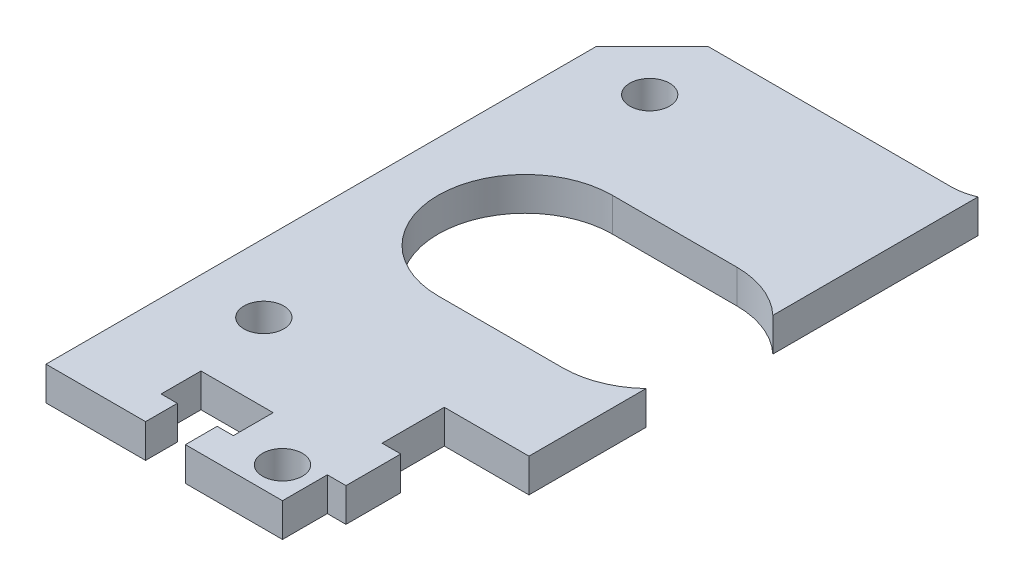
ISO-10303-21;
HEADER;
FILE_DESCRIPTION(('STEP AP214'),'2;1');
FILE_NAME('part.step','',(''),(''),'','','');
FILE_SCHEMA(('AUTOMOTIVE_DESIGN { 1 0 10303 214 1 1 1 1 }'));
ENDSEC;
DATA;
#1=APPLICATION_CONTEXT('core data for automotive mechanical design processes');
#2=APPLICATION_PROTOCOL_DEFINITION('international standard','automotive_design',2000,#1);
#3=PRODUCT_CONTEXT('',#1,'mechanical');
#4=PRODUCT('Part','Part','',(#3));
#5=PRODUCT_RELATED_PRODUCT_CATEGORY('part','',(#4));
#6=PRODUCT_DEFINITION_FORMATION('','',#4);
#7=PRODUCT_DEFINITION_CONTEXT('part definition',#1,'design');
#8=PRODUCT_DEFINITION('design','',#6,#7);
#9=PRODUCT_DEFINITION_SHAPE('','',#8);
#10=(LENGTH_UNIT() NAMED_UNIT(*) SI_UNIT(.MILLI.,.METRE.));
#11=(NAMED_UNIT(*) PLANE_ANGLE_UNIT() SI_UNIT($,.RADIAN.));
#12=(NAMED_UNIT(*) SI_UNIT($,.STERADIAN.) SOLID_ANGLE_UNIT());
#13=UNCERTAINTY_MEASURE_WITH_UNIT(LENGTH_MEASURE(1.E-05),#10,'distance_accuracy_value','');
#14=(GEOMETRIC_REPRESENTATION_CONTEXT(3) GLOBAL_UNCERTAINTY_ASSIGNED_CONTEXT((#13)) GLOBAL_UNIT_ASSIGNED_CONTEXT((#10,
#11,#12)) REPRESENTATION_CONTEXT('',''));
#15=CARTESIAN_POINT('',(0.,0.,0.));
#16=DIRECTION('',(0.,0.,1.));
#17=DIRECTION('',(1.,0.,0.));
#18=AXIS2_PLACEMENT_3D('',#15,#16,#17);
#19=CARTESIAN_POINT('',(0.,-1.35,0.));
#20=DIRECTION('',(0.,1.,0.));
#21=DIRECTION('',(1.,0.,0.));
#22=AXIS2_PLACEMENT_3D('',#19,#20,#21);
#23=PLANE('',#22);
#24=DIRECTION('',(1.,0.,0.));
#25=VECTOR('',#24,1.);
#26=CARTESIAN_POINT('',(-21.,-1.35,27.5));
#27=LINE('',#26,#25);
#28=CARTESIAN_POINT('',(-21.,-1.35,27.5));
#29=VERTEX_POINT('',#28);
#30=CARTESIAN_POINT('',(-13.,-1.35,27.5));
#31=VERTEX_POINT('',#30);
#32=EDGE_CURVE('E211',#29,#31,#27,.T.);
#33=ORIENTED_EDGE('',*,*,#32,.F.);
#34=DIRECTION('',(0.,0.,1.));
#35=VECTOR('',#34,1.);
#36=CARTESIAN_POINT('',(-21.,-1.35,-16.7));
#37=LINE('',#36,#35);
#38=CARTESIAN_POINT('',(-21.,-1.35,-16.7));
#39=VERTEX_POINT('',#38);
#40=EDGE_CURVE('E36',#39,#29,#37,.T.);
#41=ORIENTED_EDGE('',*,*,#40,.F.);
#42=DIRECTION('',(0.707106781186548,0.,-0.707106781186548));
#43=VECTOR('',#42,1.);
#44=CARTESIAN_POINT('',(-21.,-1.35,-16.7));
#45=LINE('',#44,#43);
#46=CARTESIAN_POINT('',(-16.5,-1.35,-21.2));
#47=VERTEX_POINT('',#46);
#48=EDGE_CURVE('E11',#39,#47,#45,.T.);
#49=ORIENTED_EDGE('',*,*,#48,.T.);
#50=DIRECTION('',(-1.,0.,0.));
#51=VECTOR('',#50,1.);
#52=CARTESIAN_POINT('',(3.,-1.35,-21.2));
#53=LINE('',#52,#51);
#54=CARTESIAN_POINT('',(3.,-1.35,-21.2));
#55=VERTEX_POINT('',#54);
#56=EDGE_CURVE('E237',#55,#47,#53,.T.);
#57=ORIENTED_EDGE('',*,*,#56,.F.);
#58=CARTESIAN_POINT('',(3.,-1.35,-25.7));
#59=DIRECTION('',(0.,1.,0.));
#60=DIRECTION('',(0.,0.,1.));
#61=AXIS2_PLACEMENT_3D('',#58,#59,#60);
#62=CIRCLE('',#61,4.5);
#63=CARTESIAN_POINT('',(4.8,-1.35,-21.57568187454));
#64=VERTEX_POINT('',#63);
#65=EDGE_CURVE('E27',#55,#64,#62,.T.);
#66=ORIENTED_EDGE('',*,*,#65,.T.);
#67=DIRECTION('',(0.,0.,-1.));
#68=VECTOR('',#67,1.);
#69=CARTESIAN_POINT('',(4.8,-1.35,-5.095095681143));
#70=LINE('',#69,#68);
#71=CARTESIAN_POINT('',(4.8,-1.35,-5.095095681143));
#72=VERTEX_POINT('',#71);
#73=EDGE_CURVE('E246',#72,#64,#70,.T.);
#74=ORIENTED_EDGE('',*,*,#73,.F.);
#75=CARTESIAN_POINT('',(0.,-1.35,0.));
#76=DIRECTION('',(0.,-1.,0.));
#77=DIRECTION('',(0.,0.,-1.));
#78=AXIS2_PLACEMENT_3D('',#75,#76,#77);
#79=CIRCLE('',#78,7.);
#80=CARTESIAN_POINT('',(0.,-1.35,-7.));
#81=VERTEX_POINT('',#80);
#82=EDGE_CURVE('E257',#81,#72,#79,.T.);
#83=ORIENTED_EDGE('',*,*,#82,.F.);
#84=DIRECTION('',(1.,0.,0.));
#85=VECTOR('',#84,1.);
#86=CARTESIAN_POINT('',(-10.,-1.35,-7.));
#87=LINE('',#86,#85);
#88=CARTESIAN_POINT('',(-10.,-1.35,-7.));
#89=VERTEX_POINT('',#88);
#90=EDGE_CURVE('E231',#89,#81,#87,.T.);
#91=ORIENTED_EDGE('',*,*,#90,.F.);
#92=CARTESIAN_POINT('',(-10.,-1.35,0.));
#93=DIRECTION('',(0.,-1.,0.));
#94=DIRECTION('',(0.,0.,1.));
#95=AXIS2_PLACEMENT_3D('',#92,#93,#94);
#96=CIRCLE('',#95,7.);
#97=CARTESIAN_POINT('',(-10.,-1.35,7.));
#98=VERTEX_POINT('',#97);
#99=EDGE_CURVE('E285',#98,#89,#96,.T.);
#100=ORIENTED_EDGE('',*,*,#99,.F.);
#101=DIRECTION('',(-1.,0.,0.));
#102=VECTOR('',#101,1.);
#103=CARTESIAN_POINT('',(0.,-1.35,7.));
#104=LINE('',#103,#102);
#105=CARTESIAN_POINT('',(0.,-1.35,7.));
#106=VERTEX_POINT('',#105);
#107=EDGE_CURVE('E288',#106,#98,#104,.T.);
#108=ORIENTED_EDGE('',*,*,#107,.F.);
#109=CARTESIAN_POINT('',(0.,-1.35,0.));
#110=DIRECTION('',(0.,-1.,0.));
#111=DIRECTION('',(0.685714285714307,0.,0.727870811591808));
#112=AXIS2_PLACEMENT_3D('',#109,#110,#111);
#113=CIRCLE('',#112,7.);
#114=CARTESIAN_POINT('',(4.8,-1.35,5.095095681143));
#115=VERTEX_POINT('',#114);
#116=EDGE_CURVE('E281',#115,#106,#113,.T.);
#117=ORIENTED_EDGE('',*,*,#116,.F.);
#118=DIRECTION('',(0.,0.,-1.));
#119=VECTOR('',#118,1.);
#120=CARTESIAN_POINT('',(4.8,-1.35,14.5));
#121=LINE('',#120,#119);
#122=CARTESIAN_POINT('',(4.8,-1.35,14.5));
#123=VERTEX_POINT('',#122);
#124=EDGE_CURVE('E245',#123,#115,#121,.T.);
#125=ORIENTED_EDGE('',*,*,#124,.F.);
#126=DIRECTION('',(-1.,0.,0.));
#127=VECTOR('',#126,1.);
#128=CARTESIAN_POINT('',(4.8,-1.35,14.5));
#129=LINE('',#128,#127);
#130=CARTESIAN_POINT('',(-2.,-1.35,14.5));
#131=VERTEX_POINT('',#130);
#132=EDGE_CURVE('E421',#123,#131,#129,.T.);
#133=ORIENTED_EDGE('',*,*,#132,.T.);
#134=DIRECTION('',(0.,0.,1.));
#135=VECTOR('',#134,1.);
#136=CARTESIAN_POINT('',(-2.,-1.35,14.5));
#137=LINE('',#136,#135);
#138=CARTESIAN_POINT('',(-2.,-1.35,19.5));
#139=VERTEX_POINT('',#138);
#140=EDGE_CURVE('E442',#131,#139,#137,.T.);
#141=ORIENTED_EDGE('',*,*,#140,.T.);
#142=DIRECTION('',(1.,0.,0.));
#143=VECTOR('',#142,1.);
#144=CARTESIAN_POINT('',(-2.,-1.35,19.5));
#145=LINE('',#144,#143);
#146=CARTESIAN_POINT('',(-0.5,-1.35,19.5));
#147=VERTEX_POINT('',#146);
#148=EDGE_CURVE('E445',#139,#147,#145,.T.);
#149=ORIENTED_EDGE('',*,*,#148,.T.);
#150=DIRECTION('',(0.,0.,1.));
#151=VECTOR('',#150,1.);
#152=CARTESIAN_POINT('',(-0.5,-1.35,19.5));
#153=LINE('',#152,#151);
#154=CARTESIAN_POINT('',(-0.5,-1.35,23.9));
#155=VERTEX_POINT('',#154);
#156=EDGE_CURVE('E448',#147,#155,#153,.T.);
#157=ORIENTED_EDGE('',*,*,#156,.T.);
#158=DIRECTION('',(-1.,0.,0.));
#159=VECTOR('',#158,1.);
#160=CARTESIAN_POINT('',(-0.5,-1.35,23.9));
#161=LINE('',#160,#159);
#162=CARTESIAN_POINT('',(-2.,-1.35,23.9));
#163=VERTEX_POINT('',#162);
#164=EDGE_CURVE('E451',#155,#163,#161,.T.);
#165=ORIENTED_EDGE('',*,*,#164,.T.);
#166=DIRECTION('',(0.,0.,-1.));
#167=VECTOR('',#166,1.);
#168=CARTESIAN_POINT('',(-2.,-1.35,27.5));
#169=LINE('',#168,#167);
#170=CARTESIAN_POINT('',(-2.,-1.35,27.5));
#171=VERTEX_POINT('',#170);
#172=EDGE_CURVE('E277',#171,#163,#169,.T.);
#173=ORIENTED_EDGE('',*,*,#172,.F.);
#174=DIRECTION('',(1.,0.,0.));
#175=VECTOR('',#174,1.);
#176=CARTESIAN_POINT('',(-9.8,-1.35,27.5));
#177=LINE('',#176,#175);
#178=CARTESIAN_POINT('',(-9.8,-1.35,27.5));
#179=VERTEX_POINT('',#178);
#180=EDGE_CURVE('E213',#179,#171,#177,.T.);
#181=ORIENTED_EDGE('',*,*,#180,.F.);
#182=DIRECTION('',(0.,0.,-1.));
#183=VECTOR('',#182,1.);
#184=CARTESIAN_POINT('',(-9.8,-1.35,27.5));
#185=LINE('',#184,#183);
#186=CARTESIAN_POINT('',(-9.8,-1.35,24.95));
#187=VERTEX_POINT('',#186);
#188=EDGE_CURVE('E454',#179,#187,#185,.T.);
#189=ORIENTED_EDGE('',*,*,#188,.T.);
#190=DIRECTION('',(1.,0.,0.));
#191=VECTOR('',#190,1.);
#192=CARTESIAN_POINT('',(-9.8,-1.35,24.95));
#193=LINE('',#192,#191);
#194=CARTESIAN_POINT('',(-8.5,-1.35,24.95));
#195=VERTEX_POINT('',#194);
#196=EDGE_CURVE('E458',#187,#195,#193,.T.);
#197=ORIENTED_EDGE('',*,*,#196,.T.);
#198=DIRECTION('',(0.,0.,-1.));
#199=VECTOR('',#198,1.);
#200=CARTESIAN_POINT('',(-8.5,-1.35,24.95));
#201=LINE('',#200,#199);
#202=CARTESIAN_POINT('',(-8.5,-1.35,21.75));
#203=VERTEX_POINT('',#202);
#204=EDGE_CURVE('E403',#195,#203,#201,.T.);
#205=ORIENTED_EDGE('',*,*,#204,.T.);
#206=DIRECTION('',(-1.,0.,0.));
#207=VECTOR('',#206,1.);
#208=CARTESIAN_POINT('',(-8.5,-1.35,21.75));
#209=LINE('',#208,#207);
#210=CARTESIAN_POINT('',(-14.3,-1.35,21.75));
#211=VERTEX_POINT('',#210);
#212=EDGE_CURVE('E401',#203,#211,#209,.T.);
#213=ORIENTED_EDGE('',*,*,#212,.T.);
#214=DIRECTION('',(0.,0.,1.));
#215=VECTOR('',#214,1.);
#216=CARTESIAN_POINT('',(-14.3,-1.35,21.75));
#217=LINE('',#216,#215);
#218=CARTESIAN_POINT('',(-14.3,-1.35,24.95));
#219=VERTEX_POINT('',#218);
#220=EDGE_CURVE('E396',#211,#219,#217,.T.);
#221=ORIENTED_EDGE('',*,*,#220,.T.);
#222=DIRECTION('',(1.,0.,0.));
#223=VECTOR('',#222,1.);
#224=CARTESIAN_POINT('',(-14.3,-1.35,24.95));
#225=LINE('',#224,#223);
#226=CARTESIAN_POINT('',(-13.,-1.35,24.95));
#227=VERTEX_POINT('',#226);
#228=EDGE_CURVE('E393',#219,#227,#225,.T.);
#229=ORIENTED_EDGE('',*,*,#228,.T.);
#230=DIRECTION('',(0.,0.,-1.));
#231=VECTOR('',#230,1.);
#232=CARTESIAN_POINT('',(-13.,-1.35,27.5));
#233=LINE('',#232,#231);
#234=EDGE_CURVE('E215',#31,#227,#233,.T.);
#235=ORIENTED_EDGE('',*,*,#234,.F.);
#236=EDGE_LOOP('',(#33,#41,#49,#57,#66,#74,#83,#91,#100,#108,#117,#125,#133,#141,#149,#157,#165,
#173,#181,#189,#197,#205,#213,#221,#229,#235));
#237=FACE_BOUND('',#236,.T.);
#238=CARTESIAN_POINT('',(-15.5,-1.35,15.5));
#239=DIRECTION('',(0.,-1.,0.));
#240=DIRECTION('',(-1.,0.,0.));
#241=AXIS2_PLACEMENT_3D('',#238,#239,#240);
#242=CIRCLE('',#241,1.6);
#243=CARTESIAN_POINT('',(-17.1,-1.35,15.5));
#244=VERTEX_POINT('',#243);
#245=EDGE_CURVE('E324',#244,#244,#242,.T.);
#246=ORIENTED_EDGE('',*,*,#245,.F.);
#247=EDGE_LOOP('',(#246));
#248=FACE_BOUND('',#247,.T.);
#249=CARTESIAN_POINT('',(-15.5,-1.35,-15.5));
#250=DIRECTION('',(0.,-1.,0.));
#251=DIRECTION('',(-1.,0.,0.));
#252=AXIS2_PLACEMENT_3D('',#249,#250,#251);
#253=CIRCLE('',#252,1.6);
#254=CARTESIAN_POINT('',(-17.1,-1.35,-15.5));
#255=VERTEX_POINT('',#254);
#256=EDGE_CURVE('E371',#255,#255,#253,.T.);
#257=ORIENTED_EDGE('',*,*,#256,.F.);
#258=EDGE_LOOP('',(#257));
#259=FACE_BOUND('',#258,.T.);
#260=CARTESIAN_POINT('',(-4.5,-1.35,25.));
#261=DIRECTION('',(0.,-1.,0.));
#262=DIRECTION('',(-1.,0.,0.));
#263=AXIS2_PLACEMENT_3D('',#260,#261,#262);
#264=CIRCLE('',#263,1.6);
#265=CARTESIAN_POINT('',(-6.1,-1.35,25.));
#266=VERTEX_POINT('',#265);
#267=EDGE_CURVE('E375',#266,#266,#264,.T.);
#268=ORIENTED_EDGE('',*,*,#267,.F.);
#269=EDGE_LOOP('',(#268));
#270=FACE_BOUND('',#269,.T.);
#271=ADVANCED_FACE('F17',(#237,#248,#259,#270),#23,.F.);
#272=CARTESIAN_POINT('',(-15.5,1.35,15.5));
#273=DIRECTION('',(0.,-1.,0.));
#274=DIRECTION('',(1.,0.,0.));
#275=AXIS2_PLACEMENT_3D('',#272,#273,#274);
#276=CYLINDRICAL_SURFACE('',#275,1.6);
#277=ORIENTED_EDGE('',*,*,#245,.T.);
#278=EDGE_LOOP('',(#277));
#279=FACE_BOUND('',#278,.T.);
#280=CARTESIAN_POINT('',(-15.5,1.35,15.5));
#281=DIRECTION('',(0.,-1.,0.));
#282=DIRECTION('',(1.,0.,0.));
#283=AXIS2_PLACEMENT_3D('',#280,#281,#282);
#284=CIRCLE('',#283,1.6);
#285=CARTESIAN_POINT('',(-13.9,1.35,15.5));
#286=VERTEX_POINT('',#285);
#287=EDGE_CURVE('E203',#286,#286,#284,.T.);
#288=ORIENTED_EDGE('',*,*,#287,.F.);
#289=EDGE_LOOP('',(#288));
#290=FACE_BOUND('',#289,.T.);
#291=ADVANCED_FACE('F520',(#279,#290),#276,.F.);
#292=CARTESIAN_POINT('',(0.,1.35,0.));
#293=DIRECTION('',(0.,1.,0.));
#294=DIRECTION('',(1.,0.,0.));
#295=AXIS2_PLACEMENT_3D('',#292,#293,#294);
#296=PLANE('',#295);
#297=DIRECTION('',(1.,0.,0.));
#298=VECTOR('',#297,1.);
#299=CARTESIAN_POINT('',(-14.3,1.35,24.95));
#300=LINE('',#299,#298);
#301=CARTESIAN_POINT('',(-14.3,1.35,24.95));
#302=VERTEX_POINT('',#301);
#303=CARTESIAN_POINT('',(-13.,1.35,24.95));
#304=VERTEX_POINT('',#303);
#305=EDGE_CURVE('E318',#302,#304,#300,.T.);
#306=ORIENTED_EDGE('',*,*,#305,.F.);
#307=DIRECTION('',(0.,0.,1.));
#308=VECTOR('',#307,1.);
#309=CARTESIAN_POINT('',(-14.3,1.35,21.75));
#310=LINE('',#309,#308);
#311=CARTESIAN_POINT('',(-14.3,1.35,21.75));
#312=VERTEX_POINT('',#311);
#313=EDGE_CURVE('E296',#312,#302,#310,.T.);
#314=ORIENTED_EDGE('',*,*,#313,.F.);
#315=DIRECTION('',(-1.,0.,0.));
#316=VECTOR('',#315,1.);
#317=CARTESIAN_POINT('',(-8.5,1.35,21.75));
#318=LINE('',#317,#316);
#319=CARTESIAN_POINT('',(-8.5,1.35,21.75));
#320=VERTEX_POINT('',#319);
#321=EDGE_CURVE('E300',#320,#312,#318,.T.);
#322=ORIENTED_EDGE('',*,*,#321,.F.);
#323=DIRECTION('',(0.,0.,-1.));
#324=VECTOR('',#323,1.);
#325=CARTESIAN_POINT('',(-8.5,1.35,24.95));
#326=LINE('',#325,#324);
#327=CARTESIAN_POINT('',(-8.5,1.35,24.95));
#328=VERTEX_POINT('',#327);
#329=EDGE_CURVE('E305',#328,#320,#326,.T.);
#330=ORIENTED_EDGE('',*,*,#329,.F.);
#331=DIRECTION('',(1.,0.,0.));
#332=VECTOR('',#331,1.);
#333=CARTESIAN_POINT('',(-9.8,1.35,24.95));
#334=LINE('',#333,#332);
#335=CARTESIAN_POINT('',(-9.8,1.35,24.95));
#336=VERTEX_POINT('',#335);
#337=EDGE_CURVE('E302',#336,#328,#334,.T.);
#338=ORIENTED_EDGE('',*,*,#337,.F.);
#339=DIRECTION('',(0.,0.,-1.));
#340=VECTOR('',#339,1.);
#341=CARTESIAN_POINT('',(-9.8,1.35,27.5));
#342=LINE('',#341,#340);
#343=CARTESIAN_POINT('',(-9.8,1.35,27.5));
#344=VERTEX_POINT('',#343);
#345=EDGE_CURVE('E232',#344,#336,#342,.T.);
#346=ORIENTED_EDGE('',*,*,#345,.F.);
#347=DIRECTION('',(1.,0.,0.));
#348=VECTOR('',#347,1.);
#349=CARTESIAN_POINT('',(-9.8,1.35,27.5));
#350=LINE('',#349,#348);
#351=CARTESIAN_POINT('',(-2.,1.35,27.5));
#352=VERTEX_POINT('',#351);
#353=EDGE_CURVE('E321',#344,#352,#350,.T.);
#354=ORIENTED_EDGE('',*,*,#353,.T.);
#355=DIRECTION('',(0.,0.,-1.));
#356=VECTOR('',#355,1.);
#357=CARTESIAN_POINT('',(-2.,1.35,27.5));
#358=LINE('',#357,#356);
#359=CARTESIAN_POINT('',(-2.,1.35,23.9));
#360=VERTEX_POINT('',#359);
#361=EDGE_CURVE('E325',#352,#360,#358,.T.);
#362=ORIENTED_EDGE('',*,*,#361,.T.);
#363=DIRECTION('',(-1.,0.,0.));
#364=VECTOR('',#363,1.);
#365=CARTESIAN_POINT('',(-0.5,1.35,23.9));
#366=LINE('',#365,#364);
#367=CARTESIAN_POINT('',(-0.5,1.35,23.9));
#368=VERTEX_POINT('',#367);
#369=EDGE_CURVE('E273',#368,#360,#366,.T.);
#370=ORIENTED_EDGE('',*,*,#369,.F.);
#371=DIRECTION('',(0.,0.,1.));
#372=VECTOR('',#371,1.);
#373=CARTESIAN_POINT('',(-0.5,1.35,19.5));
#374=LINE('',#373,#372);
#375=CARTESIAN_POINT('',(-0.5,1.35,19.5));
#376=VERTEX_POINT('',#375);
#377=EDGE_CURVE('E269',#376,#368,#374,.T.);
#378=ORIENTED_EDGE('',*,*,#377,.F.);
#379=DIRECTION('',(1.,0.,0.));
#380=VECTOR('',#379,1.);
#381=CARTESIAN_POINT('',(-2.,1.35,19.5));
#382=LINE('',#381,#380);
#383=CARTESIAN_POINT('',(-2.,1.35,19.5));
#384=VERTEX_POINT('',#383);
#385=EDGE_CURVE('E265',#384,#376,#382,.T.);
#386=ORIENTED_EDGE('',*,*,#385,.F.);
#387=DIRECTION('',(0.,0.,1.));
#388=VECTOR('',#387,1.);
#389=CARTESIAN_POINT('',(-2.,1.35,14.5));
#390=LINE('',#389,#388);
#391=CARTESIAN_POINT('',(-2.,1.35,14.5));
#392=VERTEX_POINT('',#391);
#393=EDGE_CURVE('E253',#392,#384,#390,.T.);
#394=ORIENTED_EDGE('',*,*,#393,.F.);
#395=DIRECTION('',(-1.,0.,0.));
#396=VECTOR('',#395,1.);
#397=CARTESIAN_POINT('',(4.8,1.35,14.5));
#398=LINE('',#397,#396);
#399=CARTESIAN_POINT('',(4.8,1.35,14.5));
#400=VERTEX_POINT('',#399);
#401=EDGE_CURVE('E261',#400,#392,#398,.T.);
#402=ORIENTED_EDGE('',*,*,#401,.F.);
#403=DIRECTION('',(0.,0.,-1.));
#404=VECTOR('',#403,1.);
#405=CARTESIAN_POINT('',(4.8,1.35,14.5));
#406=LINE('',#405,#404);
#407=CARTESIAN_POINT('',(4.8,1.35,5.095095681143));
#408=VERTEX_POINT('',#407);
#409=EDGE_CURVE('E328',#400,#408,#406,.T.);
#410=ORIENTED_EDGE('',*,*,#409,.T.);
#411=CARTESIAN_POINT('',(0.,1.35,0.));
#412=DIRECTION('',(0.,-1.,0.));
#413=DIRECTION('',(0.685714285714307,0.,0.727870811591808));
#414=AXIS2_PLACEMENT_3D('',#411,#412,#413);
#415=CIRCLE('',#414,7.);
#416=CARTESIAN_POINT('',(0.,1.35,7.));
#417=VERTEX_POINT('',#416);
#418=EDGE_CURVE('E340',#408,#417,#415,.T.);
#419=ORIENTED_EDGE('',*,*,#418,.T.);
#420=DIRECTION('',(-1.,0.,0.));
#421=VECTOR('',#420,1.);
#422=CARTESIAN_POINT('',(0.,1.35,7.));
#423=LINE('',#422,#421);
#424=CARTESIAN_POINT('',(-10.,1.35,7.));
#425=VERTEX_POINT('',#424);
#426=EDGE_CURVE('E343',#417,#425,#423,.T.);
#427=ORIENTED_EDGE('',*,*,#426,.T.);
#428=CARTESIAN_POINT('',(-10.,1.35,0.));
#429=DIRECTION('',(0.,-1.,0.));
#430=DIRECTION('',(0.,0.,1.));
#431=AXIS2_PLACEMENT_3D('',#428,#429,#430);
#432=CIRCLE('',#431,7.);
#433=CARTESIAN_POINT('',(-10.,1.35,-7.));
#434=VERTEX_POINT('',#433);
#435=EDGE_CURVE('E346',#425,#434,#432,.T.);
#436=ORIENTED_EDGE('',*,*,#435,.T.);
#437=DIRECTION('',(1.,0.,0.));
#438=VECTOR('',#437,1.);
#439=CARTESIAN_POINT('',(-10.,1.35,-7.));
#440=LINE('',#439,#438);
#441=CARTESIAN_POINT('',(0.,1.35,-7.));
#442=VERTEX_POINT('',#441);
#443=EDGE_CURVE('E349',#434,#442,#440,.T.);
#444=ORIENTED_EDGE('',*,*,#443,.T.);
#445=CARTESIAN_POINT('',(0.,1.35,0.));
#446=DIRECTION('',(0.,-1.,0.));
#447=DIRECTION('',(0.,0.,-1.));
#448=AXIS2_PLACEMENT_3D('',#445,#446,#447);
#449=CIRCLE('',#448,7.);
#450=CARTESIAN_POINT('',(4.8,1.35,-5.095095681143));
#451=VERTEX_POINT('',#450);
#452=EDGE_CURVE('E352',#442,#451,#449,.T.);
#453=ORIENTED_EDGE('',*,*,#452,.T.);
#454=DIRECTION('',(0.,0.,-1.));
#455=VECTOR('',#454,1.);
#456=CARTESIAN_POINT('',(4.8,1.35,-5.095095681143));
#457=LINE('',#456,#455);
#458=CARTESIAN_POINT('',(4.8,1.35,-21.57568187454));
#459=VERTEX_POINT('',#458);
#460=EDGE_CURVE('E355',#451,#459,#457,.T.);
#461=ORIENTED_EDGE('',*,*,#460,.T.);
#462=CARTESIAN_POINT('',(3.,1.35,-25.7));
#463=DIRECTION('',(0.,-1.,0.));
#464=DIRECTION('',(0.399999999999988,0.,0.916515138991173));
#465=AXIS2_PLACEMENT_3D('',#462,#463,#464);
#466=CIRCLE('',#465,4.5);
#467=CARTESIAN_POINT('',(3.,1.35,-21.2));
#468=VERTEX_POINT('',#467);
#469=EDGE_CURVE('E358',#459,#468,#466,.T.);
#470=ORIENTED_EDGE('',*,*,#469,.T.);
#471=DIRECTION('',(-1.,0.,0.));
#472=VECTOR('',#471,1.);
#473=CARTESIAN_POINT('',(3.,1.35,-21.2));
#474=LINE('',#473,#472);
#475=CARTESIAN_POINT('',(-16.5,1.35,-21.2));
#476=VERTEX_POINT('',#475);
#477=EDGE_CURVE('E361',#468,#476,#474,.T.);
#478=ORIENTED_EDGE('',*,*,#477,.T.);
#479=DIRECTION('',(-0.707106781186548,0.,0.707106781186548));
#480=VECTOR('',#479,1.);
#481=CARTESIAN_POINT('',(-16.5,1.35,-21.2));
#482=LINE('',#481,#480);
#483=CARTESIAN_POINT('',(-21.,1.35,-16.7));
#484=VERTEX_POINT('',#483);
#485=EDGE_CURVE('E364',#476,#484,#482,.T.);
#486=ORIENTED_EDGE('',*,*,#485,.T.);
#487=DIRECTION('',(0.,0.,1.));
#488=VECTOR('',#487,1.);
#489=CARTESIAN_POINT('',(-21.,1.35,-16.7));
#490=LINE('',#489,#488);
#491=CARTESIAN_POINT('',(-21.,1.35,27.5));
#492=VERTEX_POINT('',#491);
#493=EDGE_CURVE('E208',#484,#492,#490,.T.);
#494=ORIENTED_EDGE('',*,*,#493,.T.);
#495=DIRECTION('',(1.,0.,0.));
#496=VECTOR('',#495,1.);
#497=CARTESIAN_POINT('',(-21.,1.35,27.5));
#498=LINE('',#497,#496);
#499=CARTESIAN_POINT('',(-13.,1.35,27.5));
#500=VERTEX_POINT('',#499);
#501=EDGE_CURVE('E189',#492,#500,#498,.T.);
#502=ORIENTED_EDGE('',*,*,#501,.T.);
#503=DIRECTION('',(0.,0.,-1.));
#504=VECTOR('',#503,1.);
#505=CARTESIAN_POINT('',(-13.,1.35,27.5));
#506=LINE('',#505,#504);
#507=EDGE_CURVE('E196',#500,#304,#506,.T.);
#508=ORIENTED_EDGE('',*,*,#507,.T.);
#509=EDGE_LOOP('',(#306,#314,#322,#330,#338,#346,#354,#362,#370,#378,#386,#394,#402,#410,#419,
#427,#436,#444,#453,#461,#470,#478,#486,#494,#502,#508));
#510=FACE_BOUND('',#509,.T.);
#511=ORIENTED_EDGE('',*,*,#287,.T.);
#512=EDGE_LOOP('',(#511));
#513=FACE_BOUND('',#512,.T.);
#514=CARTESIAN_POINT('',(-15.5,1.35,-15.5));
#515=DIRECTION('',(0.,-1.,0.));
#516=DIRECTION('',(-1.,0.,0.));
#517=AXIS2_PLACEMENT_3D('',#514,#515,#516);
#518=CIRCLE('',#517,1.6);
#519=CARTESIAN_POINT('',(-17.1,1.35,-15.5));
#520=VERTEX_POINT('',#519);
#521=EDGE_CURVE('E367',#520,#520,#518,.T.);
#522=ORIENTED_EDGE('',*,*,#521,.T.);
#523=EDGE_LOOP('',(#522));
#524=FACE_BOUND('',#523,.T.);
#525=CARTESIAN_POINT('',(-4.5,1.35,25.));
#526=DIRECTION('',(0.,-1.,0.));
#527=DIRECTION('',(-1.,0.,0.));
#528=AXIS2_PLACEMENT_3D('',#525,#526,#527);
#529=CIRCLE('',#528,1.6);
#530=CARTESIAN_POINT('',(-6.1,1.35,25.));
#531=VERTEX_POINT('',#530);
#532=EDGE_CURVE('E369',#531,#531,#529,.T.);
#533=ORIENTED_EDGE('',*,*,#532,.T.);
#534=EDGE_LOOP('',(#533));
#535=FACE_BOUND('',#534,.T.);
#536=ADVANCED_FACE('F205',(#510,#513,#524,#535),#296,.T.);
#537=CARTESIAN_POINT('',(-15.5,1.35,-15.5));
#538=DIRECTION('',(0.,-1.,0.));
#539=DIRECTION('',(1.,0.,0.));
#540=AXIS2_PLACEMENT_3D('',#537,#538,#539);
#541=CYLINDRICAL_SURFACE('',#540,1.6);
#542=ORIENTED_EDGE('',*,*,#256,.T.);
#543=EDGE_LOOP('',(#542));
#544=FACE_BOUND('',#543,.T.);
#545=ORIENTED_EDGE('',*,*,#521,.F.);
#546=EDGE_LOOP('',(#545));
#547=FACE_BOUND('',#546,.T.);
#548=ADVANCED_FACE('F530',(#544,#547),#541,.F.);
#549=CARTESIAN_POINT('',(-4.5,1.35,25.));
#550=DIRECTION('',(0.,-1.,0.));
#551=DIRECTION('',(1.,0.,0.));
#552=AXIS2_PLACEMENT_3D('',#549,#550,#551);
#553=CYLINDRICAL_SURFACE('',#552,1.6);
#554=ORIENTED_EDGE('',*,*,#267,.T.);
#555=EDGE_LOOP('',(#554));
#556=FACE_BOUND('',#555,.T.);
#557=ORIENTED_EDGE('',*,*,#532,.F.);
#558=EDGE_LOOP('',(#557));
#559=FACE_BOUND('',#558,.T.);
#560=ADVANCED_FACE('F533',(#556,#559),#553,.F.);
#561=CARTESIAN_POINT('',(-13.,1.35,24.95));
#562=DIRECTION('',(-1.,0.,0.));
#563=DIRECTION('',(0.,0.,1.));
#564=AXIS2_PLACEMENT_3D('',#561,#562,#563);
#565=PLANE('',#564);
#566=DIRECTION('',(0.,1.,0.));
#567=VECTOR('',#566,1.);
#568=CARTESIAN_POINT('',(-13.,-1.35,24.95));
#569=LINE('',#568,#567);
#570=EDGE_CURVE('E200',#227,#304,#569,.T.);
#571=ORIENTED_EDGE('',*,*,#570,.T.);
#572=ORIENTED_EDGE('',*,*,#507,.F.);
#573=DIRECTION('',(0.,1.,0.));
#574=VECTOR('',#573,1.);
#575=CARTESIAN_POINT('',(-13.,-1.35,27.5));
#576=LINE('',#575,#574);
#577=EDGE_CURVE('E198',#31,#500,#576,.T.);
#578=ORIENTED_EDGE('',*,*,#577,.F.);
#579=ORIENTED_EDGE('',*,*,#234,.T.);
#580=EDGE_LOOP('',(#571,#572,#578,#579));
#581=FACE_BOUND('',#580,.T.);
#582=ADVANCED_FACE('F197',(#581),#565,.F.);
#583=CARTESIAN_POINT('',(-21.,-1.35,27.5));
#584=DIRECTION('',(0.,0.,1.));
#585=DIRECTION('',(1.,0.,0.));
#586=AXIS2_PLACEMENT_3D('',#583,#584,#585);
#587=PLANE('',#586);
#588=ORIENTED_EDGE('',*,*,#501,.F.);
#589=DIRECTION('',(0.,1.,0.));
#590=VECTOR('',#589,1.);
#591=CARTESIAN_POINT('',(-21.,-1.35,27.5));
#592=LINE('',#591,#590);
#593=EDGE_CURVE('E223',#29,#492,#592,.T.);
#594=ORIENTED_EDGE('',*,*,#593,.F.);
#595=ORIENTED_EDGE('',*,*,#32,.T.);
#596=ORIENTED_EDGE('',*,*,#577,.T.);
#597=EDGE_LOOP('',(#588,#594,#595,#596));
#598=FACE_BOUND('',#597,.T.);
#599=ADVANCED_FACE('F210',(#598),#587,.T.);
#600=CARTESIAN_POINT('',(-21.,-1.35,27.5));
#601=DIRECTION('',(0.,0.,1.));
#602=DIRECTION('',(1.,0.,0.));
#603=AXIS2_PLACEMENT_3D('',#600,#601,#602);
#604=PLANE('',#603);
#605=ORIENTED_EDGE('',*,*,#180,.T.);
#606=DIRECTION('',(0.,1.,0.));
#607=VECTOR('',#606,1.);
#608=CARTESIAN_POINT('',(-2.,-1.35,27.5));
#609=LINE('',#608,#607);
#610=EDGE_CURVE('E218',#171,#352,#609,.T.);
#611=ORIENTED_EDGE('',*,*,#610,.T.);
#612=ORIENTED_EDGE('',*,*,#353,.F.);
#613=DIRECTION('',(0.,1.,0.));
#614=VECTOR('',#613,1.);
#615=CARTESIAN_POINT('',(-9.8,-1.35,27.5));
#616=LINE('',#615,#614);
#617=EDGE_CURVE('E228',#179,#344,#616,.T.);
#618=ORIENTED_EDGE('',*,*,#617,.F.);
#619=EDGE_LOOP('',(#605,#611,#612,#618));
#620=FACE_BOUND('',#619,.T.);
#621=ADVANCED_FACE('F471',(#620),#604,.T.);
#622=CARTESIAN_POINT('',(-21.,-1.35,-21.2));
#623=DIRECTION('',(-1.,0.,0.));
#624=DIRECTION('',(0.,0.,1.));
#625=AXIS2_PLACEMENT_3D('',#622,#623,#624);
#626=PLANE('',#625);
#627=ORIENTED_EDGE('',*,*,#40,.T.);
#628=ORIENTED_EDGE('',*,*,#593,.T.);
#629=ORIENTED_EDGE('',*,*,#493,.F.);
#630=DIRECTION('',(0.,-1.,0.));
#631=VECTOR('',#630,1.);
#632=CARTESIAN_POINT('',(-21.,1.35,-16.7));
#633=LINE('',#632,#631);
#634=EDGE_CURVE('E225',#484,#39,#633,.T.);
#635=ORIENTED_EDGE('',*,*,#634,.T.);
#636=EDGE_LOOP('',(#627,#628,#629,#635));
#637=FACE_BOUND('',#636,.T.);
#638=ADVANCED_FACE('F407',(#637),#626,.T.);
#639=CARTESIAN_POINT('',(-18.75,0.,-18.95));
#640=DIRECTION('',(-0.707106781186548,0.,-0.707106781186548));
#641=DIRECTION('',(0.707106781186548,0.,-0.707106781186548));
#642=AXIS2_PLACEMENT_3D('',#639,#640,#641);
#643=PLANE('',#642);
#644=ORIENTED_EDGE('',*,*,#634,.F.);
#645=ORIENTED_EDGE('',*,*,#485,.F.);
#646=DIRECTION('',(0.,-1.,0.));
#647=VECTOR('',#646,1.);
#648=CARTESIAN_POINT('',(-16.5,1.35,-21.2));
#649=LINE('',#648,#647);
#650=EDGE_CURVE('E234',#476,#47,#649,.T.);
#651=ORIENTED_EDGE('',*,*,#650,.T.);
#652=ORIENTED_EDGE('',*,*,#48,.F.);
#653=EDGE_LOOP('',(#644,#645,#651,#652));
#654=FACE_BOUND('',#653,.T.);
#655=ADVANCED_FACE('F411',(#654),#643,.T.);
#656=CARTESIAN_POINT('',(7.5,-1.35,-21.2));
#657=DIRECTION('',(0.,0.,-1.));
#658=DIRECTION('',(-1.,0.,0.));
#659=AXIS2_PLACEMENT_3D('',#656,#657,#658);
#660=PLANE('',#659);
#661=ORIENTED_EDGE('',*,*,#477,.F.);
#662=DIRECTION('',(0.,1.,0.));
#663=VECTOR('',#662,1.);
#664=CARTESIAN_POINT('',(3.,-1.35,-21.2));
#665=LINE('',#664,#663);
#666=EDGE_CURVE('E238',#55,#468,#665,.T.);
#667=ORIENTED_EDGE('',*,*,#666,.F.);
#668=ORIENTED_EDGE('',*,*,#56,.T.);
#669=ORIENTED_EDGE('',*,*,#650,.F.);
#670=EDGE_LOOP('',(#661,#667,#668,#669));
#671=FACE_BOUND('',#670,.T.);
#672=ADVANCED_FACE('F423',(#671),#660,.T.);
#673=CARTESIAN_POINT('',(3.,-7.03404,-25.7));
#674=DIRECTION('',(0.,1.,0.));
#675=DIRECTION('',(0.,0.,1.));
#676=AXIS2_PLACEMENT_3D('',#673,#674,#675);
#677=CYLINDRICAL_SURFACE('',#676,4.5);
#678=ORIENTED_EDGE('',*,*,#65,.F.);
#679=ORIENTED_EDGE('',*,*,#666,.T.);
#680=ORIENTED_EDGE('',*,*,#469,.F.);
#681=DIRECTION('',(0.,1.,0.));
#682=VECTOR('',#681,1.);
#683=CARTESIAN_POINT('',(4.8,-1.35,-21.57568187454));
#684=LINE('',#683,#682);
#685=EDGE_CURVE('E242',#64,#459,#684,.T.);
#686=ORIENTED_EDGE('',*,*,#685,.F.);
#687=EDGE_LOOP('',(#678,#679,#680,#686));
#688=FACE_BOUND('',#687,.T.);
#689=ADVANCED_FACE('F420',(#688),#677,.F.);
#690=CARTESIAN_POINT('',(4.8,-1.62,-27.7));
#691=DIRECTION('',(-1.,0.,0.));
#692=DIRECTION('',(0.,0.,1.));
#693=AXIS2_PLACEMENT_3D('',#690,#691,#692);
#694=PLANE('',#693);
#695=DIRECTION('',(0.,1.,0.));
#696=VECTOR('',#695,1.);
#697=CARTESIAN_POINT('',(4.8,-1.35,5.095095681143));
#698=LINE('',#697,#696);
#699=EDGE_CURVE('E241',#115,#408,#698,.T.);
#700=ORIENTED_EDGE('',*,*,#699,.T.);
#701=ORIENTED_EDGE('',*,*,#409,.F.);
#702=DIRECTION('',(0.,1.,0.));
#703=VECTOR('',#702,1.);
#704=CARTESIAN_POINT('',(4.8,-1.35,14.5));
#705=LINE('',#704,#703);
#706=EDGE_CURVE('E249',#123,#400,#705,.T.);
#707=ORIENTED_EDGE('',*,*,#706,.F.);
#708=ORIENTED_EDGE('',*,*,#124,.T.);
#709=EDGE_LOOP('',(#700,#701,#707,#708));
#710=FACE_BOUND('',#709,.T.);
#711=ADVANCED_FACE('F494',(#710),#694,.F.);
#712=CARTESIAN_POINT('',(4.8,-1.62,-27.7));
#713=DIRECTION('',(-1.,0.,0.));
#714=DIRECTION('',(0.,0.,1.));
#715=AXIS2_PLACEMENT_3D('',#712,#713,#714);
#716=PLANE('',#715);
#717=ORIENTED_EDGE('',*,*,#685,.T.);
#718=ORIENTED_EDGE('',*,*,#460,.F.);
#719=DIRECTION('',(0.,1.,0.));
#720=VECTOR('',#719,1.);
#721=CARTESIAN_POINT('',(4.8,-1.35,-5.095095681143));
#722=LINE('',#721,#720);
#723=EDGE_CURVE('E254',#72,#451,#722,.T.);
#724=ORIENTED_EDGE('',*,*,#723,.F.);
#725=ORIENTED_EDGE('',*,*,#73,.T.);
#726=EDGE_LOOP('',(#717,#718,#724,#725));
#727=FACE_BOUND('',#726,.T.);
#728=ADVANCED_FACE('F426',(#727),#716,.F.);
#729=CARTESIAN_POINT('',(14.2,1.35,14.5));
#730=DIRECTION('',(0.,0.,-1.));
#731=DIRECTION('',(-1.,0.,0.));
#732=AXIS2_PLACEMENT_3D('',#729,#730,#731);
#733=PLANE('',#732);
#734=ORIENTED_EDGE('',*,*,#401,.T.);
#735=DIRECTION('',(0.,-1.,0.));
#736=VECTOR('',#735,1.);
#737=CARTESIAN_POINT('',(-2.,1.35,14.5));
#738=LINE('',#737,#736);
#739=EDGE_CURVE('E252',#392,#131,#738,.T.);
#740=ORIENTED_EDGE('',*,*,#739,.T.);
#741=ORIENTED_EDGE('',*,*,#132,.F.);
#742=ORIENTED_EDGE('',*,*,#706,.T.);
#743=EDGE_LOOP('',(#734,#740,#741,#742));
#744=FACE_BOUND('',#743,.T.);
#745=ADVANCED_FACE('F490',(#744),#733,.F.);
#746=CARTESIAN_POINT('',(-2.,1.35,14.5));
#747=DIRECTION('',(-1.,0.,0.));
#748=DIRECTION('',(0.,0.,1.));
#749=AXIS2_PLACEMENT_3D('',#746,#747,#748);
#750=PLANE('',#749);
#751=ORIENTED_EDGE('',*,*,#739,.F.);
#752=ORIENTED_EDGE('',*,*,#393,.T.);
#753=DIRECTION('',(0.,-1.,0.));
#754=VECTOR('',#753,1.);
#755=CARTESIAN_POINT('',(-2.,1.35,19.5));
#756=LINE('',#755,#754);
#757=EDGE_CURVE('E262',#384,#139,#756,.T.);
#758=ORIENTED_EDGE('',*,*,#757,.T.);
#759=ORIENTED_EDGE('',*,*,#140,.F.);
#760=EDGE_LOOP('',(#751,#752,#758,#759));
#761=FACE_BOUND('',#760,.T.);
#762=ADVANCED_FACE('F487',(#761),#750,.F.);
#763=CARTESIAN_POINT('',(-2.,1.35,19.5));
#764=DIRECTION('',(0.,0.,1.));
#765=DIRECTION('',(1.,0.,0.));
#766=AXIS2_PLACEMENT_3D('',#763,#764,#765);
#767=PLANE('',#766);
#768=ORIENTED_EDGE('',*,*,#757,.F.);
#769=ORIENTED_EDGE('',*,*,#385,.T.);
#770=DIRECTION('',(0.,-1.,0.));
#771=VECTOR('',#770,1.);
#772=CARTESIAN_POINT('',(-0.5,1.35,19.5));
#773=LINE('',#772,#771);
#774=EDGE_CURVE('E266',#376,#147,#773,.T.);
#775=ORIENTED_EDGE('',*,*,#774,.T.);
#776=ORIENTED_EDGE('',*,*,#148,.F.);
#777=EDGE_LOOP('',(#768,#769,#775,#776));
#778=FACE_BOUND('',#777,.T.);
#779=ADVANCED_FACE('F484',(#778),#767,.F.);
#780=CARTESIAN_POINT('',(-0.5,1.35,19.5));
#781=DIRECTION('',(-1.,0.,0.));
#782=DIRECTION('',(0.,0.,1.));
#783=AXIS2_PLACEMENT_3D('',#780,#781,#782);
#784=PLANE('',#783);
#785=ORIENTED_EDGE('',*,*,#774,.F.);
#786=ORIENTED_EDGE('',*,*,#377,.T.);
#787=DIRECTION('',(0.,-1.,0.));
#788=VECTOR('',#787,1.);
#789=CARTESIAN_POINT('',(-0.5,1.35,23.9));
#790=LINE('',#789,#788);
#791=EDGE_CURVE('E270',#368,#155,#790,.T.);
#792=ORIENTED_EDGE('',*,*,#791,.T.);
#793=ORIENTED_EDGE('',*,*,#156,.F.);
#794=EDGE_LOOP('',(#785,#786,#792,#793));
#795=FACE_BOUND('',#794,.T.);
#796=ADVANCED_FACE('F480',(#795),#784,.F.);
#797=CARTESIAN_POINT('',(-0.5,1.35,23.9));
#798=DIRECTION('',(0.,0.,-1.));
#799=DIRECTION('',(-1.,0.,0.));
#800=AXIS2_PLACEMENT_3D('',#797,#798,#799);
#801=PLANE('',#800);
#802=ORIENTED_EDGE('',*,*,#791,.F.);
#803=ORIENTED_EDGE('',*,*,#369,.T.);
#804=DIRECTION('',(0.,-1.,0.));
#805=VECTOR('',#804,1.);
#806=CARTESIAN_POINT('',(-2.,1.35,23.9));
#807=LINE('',#806,#805);
#808=EDGE_CURVE('E274',#360,#163,#807,.T.);
#809=ORIENTED_EDGE('',*,*,#808,.T.);
#810=ORIENTED_EDGE('',*,*,#164,.F.);
#811=EDGE_LOOP('',(#802,#803,#809,#810));
#812=FACE_BOUND('',#811,.T.);
#813=ADVANCED_FACE('F481',(#812),#801,.F.);
#814=CARTESIAN_POINT('',(-2.,1.35,23.9));
#815=DIRECTION('',(-1.,0.,0.));
#816=DIRECTION('',(0.,0.,1.));
#817=AXIS2_PLACEMENT_3D('',#814,#815,#816);
#818=PLANE('',#817);
#819=ORIENTED_EDGE('',*,*,#808,.F.);
#820=ORIENTED_EDGE('',*,*,#361,.F.);
#821=ORIENTED_EDGE('',*,*,#610,.F.);
#822=ORIENTED_EDGE('',*,*,#172,.T.);
#823=EDGE_LOOP('',(#819,#820,#821,#822));
#824=FACE_BOUND('',#823,.T.);
#825=ADVANCED_FACE('F475',(#824),#818,.F.);
#826=CARTESIAN_POINT('',(0.,-1.35,0.));
#827=DIRECTION('',(0.,1.,0.));
#828=DIRECTION('',(1.,0.,0.));
#829=AXIS2_PLACEMENT_3D('',#826,#827,#828);
#830=CYLINDRICAL_SURFACE('',#829,7.);
#831=ORIENTED_EDGE('',*,*,#116,.T.);
#832=DIRECTION('',(0.,1.,0.));
#833=VECTOR('',#832,1.);
#834=CARTESIAN_POINT('',(0.,-1.35,7.));
#835=LINE('',#834,#833);
#836=EDGE_CURVE('E278',#106,#417,#835,.T.);
#837=ORIENTED_EDGE('',*,*,#836,.T.);
#838=ORIENTED_EDGE('',*,*,#418,.F.);
#839=ORIENTED_EDGE('',*,*,#699,.F.);
#840=EDGE_LOOP('',(#831,#837,#838,#839));
#841=FACE_BOUND('',#840,.T.);
#842=ADVANCED_FACE('F497',(#841),#830,.F.);
#843=CARTESIAN_POINT('',(0.,-1.35,0.));
#844=DIRECTION('',(0.,1.,0.));
#845=DIRECTION('',(1.,0.,0.));
#846=AXIS2_PLACEMENT_3D('',#843,#844,#845);
#847=CYLINDRICAL_SURFACE('',#846,7.);
#848=ORIENTED_EDGE('',*,*,#452,.F.);
#849=DIRECTION('',(0.,1.,0.));
#850=VECTOR('',#849,1.);
#851=CARTESIAN_POINT('',(0.,-1.35,-7.));
#852=LINE('',#851,#850);
#853=EDGE_CURVE('E282',#81,#442,#852,.T.);
#854=ORIENTED_EDGE('',*,*,#853,.F.);
#855=ORIENTED_EDGE('',*,*,#82,.T.);
#856=ORIENTED_EDGE('',*,*,#723,.T.);
#857=EDGE_LOOP('',(#848,#854,#855,#856));
#858=FACE_BOUND('',#857,.T.);
#859=ADVANCED_FACE('F509',(#858),#847,.F.);
#860=CARTESIAN_POINT('',(0.,-1.35,7.));
#861=DIRECTION('',(0.,0.,-1.));
#862=DIRECTION('',(-1.,0.,0.));
#863=AXIS2_PLACEMENT_3D('',#860,#861,#862);
#864=PLANE('',#863);
#865=DIRECTION('',(0.,1.,0.));
#866=VECTOR('',#865,1.);
#867=CARTESIAN_POINT('',(-10.,-1.35,7.));
#868=LINE('',#867,#866);
#869=EDGE_CURVE('E258',#98,#425,#868,.T.);
#870=ORIENTED_EDGE('',*,*,#869,.T.);
#871=ORIENTED_EDGE('',*,*,#426,.F.);
#872=ORIENTED_EDGE('',*,*,#836,.F.);
#873=ORIENTED_EDGE('',*,*,#107,.T.);
#874=EDGE_LOOP('',(#870,#871,#872,#873));
#875=FACE_BOUND('',#874,.T.);
#876=ADVANCED_FACE('F501',(#875),#864,.T.);
#877=CARTESIAN_POINT('',(-10.,-1.35,0.));
#878=DIRECTION('',(0.,1.,0.));
#879=DIRECTION('',(1.,0.,0.));
#880=AXIS2_PLACEMENT_3D('',#877,#878,#879);
#881=CYLINDRICAL_SURFACE('',#880,7.);
#882=DIRECTION('',(0.,1.,0.));
#883=VECTOR('',#882,1.);
#884=CARTESIAN_POINT('',(-10.,-1.35,-7.));
#885=LINE('',#884,#883);
#886=EDGE_CURVE('E289',#89,#434,#885,.T.);
#887=ORIENTED_EDGE('',*,*,#886,.T.);
#888=ORIENTED_EDGE('',*,*,#435,.F.);
#889=ORIENTED_EDGE('',*,*,#869,.F.);
#890=ORIENTED_EDGE('',*,*,#99,.T.);
#891=EDGE_LOOP('',(#887,#888,#889,#890));
#892=FACE_BOUND('',#891,.T.);
#893=ADVANCED_FACE('F503',(#892),#881,.F.);
#894=CARTESIAN_POINT('',(-10.,-1.35,-7.));
#895=DIRECTION('',(0.,0.,1.));
#896=DIRECTION('',(1.,0.,0.));
#897=AXIS2_PLACEMENT_3D('',#894,#895,#896);
#898=PLANE('',#897);
#899=ORIENTED_EDGE('',*,*,#853,.T.);
#900=ORIENTED_EDGE('',*,*,#443,.F.);
#901=ORIENTED_EDGE('',*,*,#886,.F.);
#902=ORIENTED_EDGE('',*,*,#90,.T.);
#903=EDGE_LOOP('',(#899,#900,#901,#902));
#904=FACE_BOUND('',#903,.T.);
#905=ADVANCED_FACE('F506',(#904),#898,.T.);
#906=CARTESIAN_POINT('',(-9.8,1.35,27.5));
#907=DIRECTION('',(1.,0.,0.));
#908=DIRECTION('',(0.,0.,-1.));
#909=AXIS2_PLACEMENT_3D('',#906,#907,#908);
#910=PLANE('',#909);
#911=ORIENTED_EDGE('',*,*,#617,.T.);
#912=ORIENTED_EDGE('',*,*,#345,.T.);
#913=DIRECTION('',(0.,1.,0.));
#914=VECTOR('',#913,1.);
#915=CARTESIAN_POINT('',(-9.8,-1.35,24.95));
#916=LINE('',#915,#914);
#917=EDGE_CURVE('E292',#187,#336,#916,.T.);
#918=ORIENTED_EDGE('',*,*,#917,.F.);
#919=ORIENTED_EDGE('',*,*,#188,.F.);
#920=EDGE_LOOP('',(#911,#912,#918,#919));
#921=FACE_BOUND('',#920,.T.);
#922=ADVANCED_FACE('F467',(#921),#910,.F.);
#923=CARTESIAN_POINT('',(-14.3,1.35,24.95));
#924=DIRECTION('',(0.,0.,1.));
#925=DIRECTION('',(1.,0.,0.));
#926=AXIS2_PLACEMENT_3D('',#923,#924,#925);
#927=PLANE('',#926);
#928=ORIENTED_EDGE('',*,*,#228,.F.);
#929=DIRECTION('',(0.,-1.,0.));
#930=VECTOR('',#929,1.);
#931=CARTESIAN_POINT('',(-14.3,1.35,24.95));
#932=LINE('',#931,#930);
#933=EDGE_CURVE('E297',#302,#219,#932,.T.);
#934=ORIENTED_EDGE('',*,*,#933,.F.);
#935=ORIENTED_EDGE('',*,*,#305,.T.);
#936=ORIENTED_EDGE('',*,*,#570,.F.);
#937=EDGE_LOOP('',(#928,#934,#935,#936));
#938=FACE_BOUND('',#937,.T.);
#939=ADVANCED_FACE('F391',(#938),#927,.F.);
#940=CARTESIAN_POINT('',(-14.3,1.35,24.95));
#941=DIRECTION('',(0.,0.,1.));
#942=DIRECTION('',(1.,0.,0.));
#943=AXIS2_PLACEMENT_3D('',#940,#941,#942);
#944=PLANE('',#943);
#945=ORIENTED_EDGE('',*,*,#337,.T.);
#946=DIRECTION('',(0.,-1.,0.));
#947=VECTOR('',#946,1.);
#948=CARTESIAN_POINT('',(-8.5,1.35,24.95));
#949=LINE('',#948,#947);
#950=EDGE_CURVE('E295',#328,#195,#949,.T.);
#951=ORIENTED_EDGE('',*,*,#950,.T.);
#952=ORIENTED_EDGE('',*,*,#196,.F.);
#953=ORIENTED_EDGE('',*,*,#917,.T.);
#954=EDGE_LOOP('',(#945,#951,#952,#953));
#955=FACE_BOUND('',#954,.T.);
#956=ADVANCED_FACE('F463',(#955),#944,.F.);
#957=CARTESIAN_POINT('',(-14.3,1.35,21.75));
#958=DIRECTION('',(-1.,0.,0.));
#959=DIRECTION('',(0.,0.,1.));
#960=AXIS2_PLACEMENT_3D('',#957,#958,#959);
#961=PLANE('',#960);
#962=DIRECTION('',(0.,-1.,0.));
#963=VECTOR('',#962,1.);
#964=CARTESIAN_POINT('',(-14.3,1.35,21.75));
#965=LINE('',#964,#963);
#966=EDGE_CURVE('E303',#312,#211,#965,.T.);
#967=ORIENTED_EDGE('',*,*,#966,.F.);
#968=ORIENTED_EDGE('',*,*,#313,.T.);
#969=ORIENTED_EDGE('',*,*,#933,.T.);
#970=ORIENTED_EDGE('',*,*,#220,.F.);
#971=EDGE_LOOP('',(#967,#968,#969,#970));
#972=FACE_BOUND('',#971,.T.);
#973=ADVANCED_FACE('F388',(#972),#961,.F.);
#974=CARTESIAN_POINT('',(-8.5,1.35,21.75));
#975=DIRECTION('',(0.,0.,-1.));
#976=DIRECTION('',(-1.,0.,0.));
#977=AXIS2_PLACEMENT_3D('',#974,#975,#976);
#978=PLANE('',#977);
#979=DIRECTION('',(0.,-1.,0.));
#980=VECTOR('',#979,1.);
#981=CARTESIAN_POINT('',(-8.5,1.35,21.75));
#982=LINE('',#981,#980);
#983=EDGE_CURVE('E21',#320,#203,#982,.T.);
#984=ORIENTED_EDGE('',*,*,#983,.F.);
#985=ORIENTED_EDGE('',*,*,#321,.T.);
#986=ORIENTED_EDGE('',*,*,#966,.T.);
#987=ORIENTED_EDGE('',*,*,#212,.F.);
#988=EDGE_LOOP('',(#984,#985,#986,#987));
#989=FACE_BOUND('',#988,.T.);
#990=ADVANCED_FACE('F461',(#989),#978,.F.);
#991=CARTESIAN_POINT('',(-8.5,1.35,24.95));
#992=DIRECTION('',(1.,0.,0.));
#993=DIRECTION('',(0.,0.,-1.));
#994=AXIS2_PLACEMENT_3D('',#991,#992,#993);
#995=PLANE('',#994);
#996=ORIENTED_EDGE('',*,*,#950,.F.);
#997=ORIENTED_EDGE('',*,*,#329,.T.);
#998=ORIENTED_EDGE('',*,*,#983,.T.);
#999=ORIENTED_EDGE('',*,*,#204,.F.);
#1000=EDGE_LOOP('',(#996,#997,#998,#999));
#1001=FACE_BOUND('',#1000,.T.);
#1002=ADVANCED_FACE('F19',(#1001),#995,.F.);
#1003=CLOSED_SHELL('',(#271,#291,#536,#548,#560,#582,#599,#621,#638,#655,#672,#689,#711,#728,
#745,#762,#779,#796,#813,#825,#842,#859,#876,#893,#905,#922,#939,#956,#973,#990,#1002));
#1004=MANIFOLD_SOLID_BREP('B1',#1003);
#1005=ADVANCED_BREP_SHAPE_REPRESENTATION('',(#18,#1004),#14);
#1006=SHAPE_DEFINITION_REPRESENTATION(#9,#1005);
ENDSEC;
END-ISO-10303-21;
